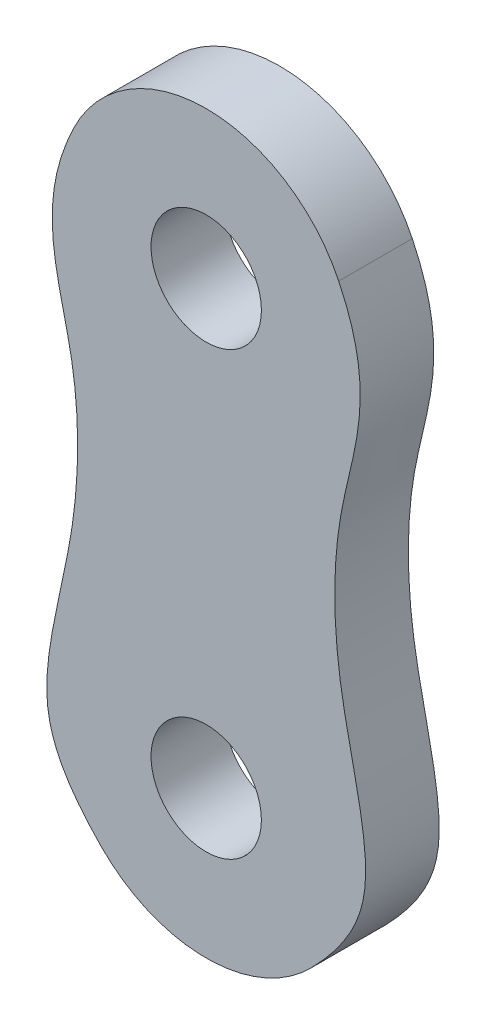
ISO-10303-21;
HEADER;
FILE_DESCRIPTION(('STEP AP214'),'2;1');
FILE_NAME('part.step','',(''),(''),'','','');
FILE_SCHEMA(('AUTOMOTIVE_DESIGN { 1 0 10303 214 1 1 1 1 }'));
ENDSEC;
DATA;
#1=APPLICATION_CONTEXT('core data for automotive mechanical design processes');
#2=APPLICATION_PROTOCOL_DEFINITION('international standard','automotive_design',2000,#1);
#3=PRODUCT_CONTEXT('',#1,'mechanical');
#4=PRODUCT('Part','Part','',(#3));
#5=PRODUCT_RELATED_PRODUCT_CATEGORY('part','',(#4));
#6=PRODUCT_DEFINITION_FORMATION('','',#4);
#7=PRODUCT_DEFINITION_CONTEXT('part definition',#1,'design');
#8=PRODUCT_DEFINITION('design','',#6,#7);
#9=PRODUCT_DEFINITION_SHAPE('','',#8);
#10=(LENGTH_UNIT() NAMED_UNIT(*) SI_UNIT(.MILLI.,.METRE.));
#11=(NAMED_UNIT(*) PLANE_ANGLE_UNIT() SI_UNIT($,.RADIAN.));
#12=(NAMED_UNIT(*) SI_UNIT($,.STERADIAN.) SOLID_ANGLE_UNIT());
#13=UNCERTAINTY_MEASURE_WITH_UNIT(LENGTH_MEASURE(1.E-05),#10,'distance_accuracy_value','');
#14=(GEOMETRIC_REPRESENTATION_CONTEXT(3) GLOBAL_UNCERTAINTY_ASSIGNED_CONTEXT((#13)) GLOBAL_UNIT_ASSIGNED_CONTEXT((#10,
#11,#12)) REPRESENTATION_CONTEXT('',''));
#15=CARTESIAN_POINT('',(0.,0.,0.));
#16=DIRECTION('',(0.,0.,1.));
#17=DIRECTION('',(1.,0.,0.));
#18=AXIS2_PLACEMENT_3D('',#15,#16,#17);
#19=CARTESIAN_POINT('',(5.71857736022503,21.8105023048572,3.175));
#20=CARTESIAN_POINT('',(7.46046495290906,18.2020579525185,3.175));
#21=CARTESIAN_POINT('',(5.43739337266652,14.1114306592331,3.175));
#22=CARTESIAN_POINT('',(5.47473955855085,6.88331535733343,3.175));
#23=CARTESIAN_POINT('',(7.33860220324202,0.649545132555866,3.175));
#24=CARTESIAN_POINT('',(6.6192049621046,-2.30987555380304,3.175));
#25=CARTESIAN_POINT('',(4.54379880332444,-4.4358079799409,3.175));
#26=B_SPLINE_CURVE_WITH_KNOTS('',3,(#19,#20,#21,#22,#23,#24,#25),.UNSPECIFIED.,.F.,.F.,(4,1,1,1,
4),(0.,0.323130598608619,0.562945369078712,0.783927572137345,1.),.UNSPECIFIED.);
#27=DIRECTION('',(0.,0.,-1.));
#28=VECTOR('',#27,1.);
#29=SURFACE_OF_LINEAR_EXTRUSION('',#26,#28);
#30=CARTESIAN_POINT('',(5.71857736022503,21.8105023048572,0.));
#31=CARTESIAN_POINT('',(7.46046495290906,18.2020579525185,0.));
#32=CARTESIAN_POINT('',(5.43739337266652,14.1114306592331,0.));
#33=CARTESIAN_POINT('',(5.47473955855085,6.88331535733343,0.));
#34=CARTESIAN_POINT('',(7.33860220324202,0.649545132555866,0.));
#35=CARTESIAN_POINT('',(6.6192049621046,-2.30987555380304,0.));
#36=CARTESIAN_POINT('',(4.54379880332444,-4.4358079799409,0.));
#37=B_SPLINE_CURVE_WITH_KNOTS('',3,(#30,#31,#32,#33,#34,#35,#36),.UNSPECIFIED.,.F.,.F.,(4,1,1,1,
4),(0.,0.323130598608619,0.562945369078712,0.783927572137345,1.),.UNSPECIFIED.);
#38=CARTESIAN_POINT('',(5.71857736022502,21.8105023048572,0.));
#39=VERTEX_POINT('',#38);
#40=CARTESIAN_POINT('',(4.54379880332444,-4.4358079799409,0.));
#41=VERTEX_POINT('',#40);
#42=EDGE_CURVE('E116',#39,#41,#37,.T.);
#43=ORIENTED_EDGE('',*,*,#42,.F.);
#44=DIRECTION('',(0.,0.,-1.));
#45=VECTOR('',#44,1.);
#46=CARTESIAN_POINT('',(5.71857736022502,21.8105023048572,3.175));
#47=LINE('',#46,#45);
#48=CARTESIAN_POINT('',(5.71857736022502,21.8105023048572,3.175));
#49=VERTEX_POINT('',#48);
#50=EDGE_CURVE('E11',#49,#39,#47,.T.);
#51=ORIENTED_EDGE('',*,*,#50,.F.);
#52=CARTESIAN_POINT('',(4.54379880332444,-4.4358079799409,3.175));
#53=VERTEX_POINT('',#52);
#54=EDGE_CURVE('E85',#49,#53,#26,.T.);
#55=ORIENTED_EDGE('',*,*,#54,.T.);
#56=DIRECTION('',(0.,0.,-1.));
#57=VECTOR('',#56,1.);
#58=CARTESIAN_POINT('',(4.54379880332444,-4.4358079799409,3.175));
#59=LINE('',#58,#57);
#60=EDGE_CURVE('E73',#53,#41,#59,.T.);
#61=ORIENTED_EDGE('',*,*,#60,.T.);
#62=EDGE_LOOP('',(#43,#51,#55,#61));
#63=FACE_BOUND('',#62,.T.);
#64=ADVANCED_FACE('F33',(#63),#29,.T.);
#65=CARTESIAN_POINT('',(0.,19.05,3.175));
#66=DIRECTION('',(0.,0.,-1.));
#67=DIRECTION('',(-1.,0.,0.));
#68=AXIS2_PLACEMENT_3D('',#65,#66,#67);
#69=CYLINDRICAL_SURFACE('',#68,6.35);
#70=CARTESIAN_POINT('',(0.,19.05,0.));
#71=DIRECTION('',(0.,0.,1.));
#72=DIRECTION('',(1.,0.,0.));
#73=AXIS2_PLACEMENT_3D('',#70,#71,#72);
#74=CIRCLE('',#73,6.35);
#75=CARTESIAN_POINT('',(-5.71857736022502,21.8105023048572,0.));
#76=VERTEX_POINT('',#75);
#77=EDGE_CURVE('E90',#39,#76,#74,.T.);
#78=ORIENTED_EDGE('',*,*,#77,.T.);
#79=DIRECTION('',(0.,0.,-1.));
#80=VECTOR('',#79,1.);
#81=CARTESIAN_POINT('',(-5.71857736022502,21.8105023048572,3.175));
#82=LINE('',#81,#80);
#83=CARTESIAN_POINT('',(-5.71857736022502,21.8105023048572,3.175));
#84=VERTEX_POINT('',#83);
#85=EDGE_CURVE('E42',#84,#76,#82,.T.);
#86=ORIENTED_EDGE('',*,*,#85,.F.);
#87=CARTESIAN_POINT('',(0.,19.05,3.175));
#88=DIRECTION('',(0.,0.,1.));
#89=DIRECTION('',(1.,0.,0.));
#90=AXIS2_PLACEMENT_3D('',#87,#88,#89);
#91=CIRCLE('',#90,6.35);
#92=EDGE_CURVE('E79',#49,#84,#91,.T.);
#93=ORIENTED_EDGE('',*,*,#92,.F.);
#94=ORIENTED_EDGE('',*,*,#50,.T.);
#95=EDGE_LOOP('',(#78,#86,#93,#94));
#96=FACE_BOUND('',#95,.T.);
#97=ADVANCED_FACE('F88',(#96),#69,.T.);
#98=CARTESIAN_POINT('',(-5.71857736022503,21.8105023048572,3.175));
#99=CARTESIAN_POINT('',(-7.46046495290906,18.2020579525185,3.175));
#100=CARTESIAN_POINT('',(-5.43739337266652,14.1114306592331,3.175));
#101=CARTESIAN_POINT('',(-5.47473955855085,6.88331535733342,3.175));
#102=CARTESIAN_POINT('',(-7.33860220324202,0.649545132555867,3.175));
#103=CARTESIAN_POINT('',(-6.6192049621046,-2.30987555380304,3.175));
#104=CARTESIAN_POINT('',(-4.54379880332444,-4.4358079799409,3.175));
#105=B_SPLINE_CURVE_WITH_KNOTS('',3,(#98,#99,#100,#101,#102,#103,#104),.UNSPECIFIED.,.F.,.F.,(4,
1,1,1,4),(0.,0.323130598608619,0.562945369078712,0.783927572137345,1.),.UNSPECIFIED.);
#106=DIRECTION('',(0.,0.,-1.));
#107=VECTOR('',#106,1.);
#108=SURFACE_OF_LINEAR_EXTRUSION('',#105,#107);
#109=CARTESIAN_POINT('',(-5.71857736022503,21.8105023048572,0.));
#110=CARTESIAN_POINT('',(-7.46046495290906,18.2020579525185,0.));
#111=CARTESIAN_POINT('',(-5.43739337266652,14.1114306592331,0.));
#112=CARTESIAN_POINT('',(-5.47473955855085,6.88331535733342,0.));
#113=CARTESIAN_POINT('',(-7.33860220324202,0.649545132555867,0.));
#114=CARTESIAN_POINT('',(-6.6192049621046,-2.30987555380304,0.));
#115=CARTESIAN_POINT('',(-4.54379880332444,-4.4358079799409,0.));
#116=B_SPLINE_CURVE_WITH_KNOTS('',3,(#109,#110,#111,#112,#113,#114,#115),.UNSPECIFIED.,.F.,.F.,
(4,1,1,1,4),(0.,0.323130598608619,0.562945369078712,0.783927572137345,1.),.UNSPECIFIED.);
#117=CARTESIAN_POINT('',(-4.54379880332444,-4.4358079799409,0.));
#118=VERTEX_POINT('',#117);
#119=EDGE_CURVE('E66',#76,#118,#116,.T.);
#120=ORIENTED_EDGE('',*,*,#119,.T.);
#121=DIRECTION('',(0.,0.,-1.));
#122=VECTOR('',#121,1.);
#123=CARTESIAN_POINT('',(-4.54379880332444,-4.4358079799409,3.175));
#124=LINE('',#123,#122);
#125=CARTESIAN_POINT('',(-4.54379880332444,-4.4358079799409,3.175));
#126=VERTEX_POINT('',#125);
#127=EDGE_CURVE('E91',#126,#118,#124,.T.);
#128=ORIENTED_EDGE('',*,*,#127,.F.);
#129=EDGE_CURVE('E84',#84,#126,#105,.T.);
#130=ORIENTED_EDGE('',*,*,#129,.F.);
#131=ORIENTED_EDGE('',*,*,#85,.T.);
#132=EDGE_LOOP('',(#120,#128,#130,#131));
#133=FACE_BOUND('',#132,.T.);
#134=ADVANCED_FACE('F92',(#133),#108,.F.);
#135=CARTESIAN_POINT('',(0.,19.05,3.175));
#136=DIRECTION('',(0.,0.,-1.));
#137=DIRECTION('',(-1.,0.,0.));
#138=AXIS2_PLACEMENT_3D('',#135,#136,#137);
#139=CYLINDRICAL_SURFACE('',#138,2.38125);
#140=CARTESIAN_POINT('',(0.,19.05,3.175));
#141=DIRECTION('',(0.,0.,1.));
#142=DIRECTION('',(1.,0.,0.));
#143=AXIS2_PLACEMENT_3D('',#140,#141,#142);
#144=CIRCLE('',#143,2.38125);
#145=CARTESIAN_POINT('',(2.38125,19.05,3.175));
#146=VERTEX_POINT('',#145);
#147=EDGE_CURVE('E94',#146,#146,#144,.T.);
#148=ORIENTED_EDGE('',*,*,#147,.T.);
#149=EDGE_LOOP('',(#148));
#150=FACE_BOUND('',#149,.T.);
#151=CARTESIAN_POINT('',(0.,19.05,0.));
#152=DIRECTION('',(0.,0.,1.));
#153=DIRECTION('',(1.,0.,0.));
#154=AXIS2_PLACEMENT_3D('',#151,#152,#153);
#155=CIRCLE('',#154,2.38125);
#156=CARTESIAN_POINT('',(2.38125,19.05,0.));
#157=VERTEX_POINT('',#156);
#158=EDGE_CURVE('E137',#157,#157,#155,.T.);
#159=ORIENTED_EDGE('',*,*,#158,.F.);
#160=EDGE_LOOP('',(#159));
#161=FACE_BOUND('',#160,.T.);
#162=ADVANCED_FACE('F106',(#150,#161),#139,.F.);
#163=CARTESIAN_POINT('',(0.,0.,3.175));
#164=DIRECTION('',(0.,0.,-1.));
#165=DIRECTION('',(-1.,0.,0.));
#166=AXIS2_PLACEMENT_3D('',#163,#164,#165);
#167=CYLINDRICAL_SURFACE('',#166,6.35);
#168=CARTESIAN_POINT('',(0.,0.,0.));
#169=DIRECTION('',(0.,0.,1.));
#170=DIRECTION('',(1.,0.,0.));
#171=AXIS2_PLACEMENT_3D('',#168,#169,#170);
#172=CIRCLE('',#171,6.35);
#173=EDGE_CURVE('E132',#118,#41,#172,.T.);
#174=ORIENTED_EDGE('',*,*,#173,.T.);
#175=ORIENTED_EDGE('',*,*,#60,.F.);
#176=CARTESIAN_POINT('',(0.,0.,3.175));
#177=DIRECTION('',(0.,0.,1.));
#178=DIRECTION('',(1.,0.,0.));
#179=AXIS2_PLACEMENT_3D('',#176,#177,#178);
#180=CIRCLE('',#179,6.35);
#181=EDGE_CURVE('E50',#126,#53,#180,.T.);
#182=ORIENTED_EDGE('',*,*,#181,.F.);
#183=ORIENTED_EDGE('',*,*,#127,.T.);
#184=EDGE_LOOP('',(#174,#175,#182,#183));
#185=FACE_BOUND('',#184,.T.);
#186=ADVANCED_FACE('F107',(#185),#167,.T.);
#187=CARTESIAN_POINT('',(0.,0.,3.175));
#188=DIRECTION('',(0.,0.,-1.));
#189=DIRECTION('',(-1.,0.,0.));
#190=AXIS2_PLACEMENT_3D('',#187,#188,#189);
#191=CYLINDRICAL_SURFACE('',#190,2.38125);
#192=CARTESIAN_POINT('',(0.,0.,3.175));
#193=DIRECTION('',(0.,0.,1.));
#194=DIRECTION('',(1.,0.,0.));
#195=AXIS2_PLACEMENT_3D('',#192,#193,#194);
#196=CIRCLE('',#195,2.38125);
#197=CARTESIAN_POINT('',(2.38125,0.,3.175));
#198=VERTEX_POINT('',#197);
#199=EDGE_CURVE('E124',#198,#198,#196,.T.);
#200=ORIENTED_EDGE('',*,*,#199,.T.);
#201=EDGE_LOOP('',(#200));
#202=FACE_BOUND('',#201,.T.);
#203=CARTESIAN_POINT('',(0.,0.,0.));
#204=DIRECTION('',(0.,0.,1.));
#205=DIRECTION('',(1.,0.,0.));
#206=AXIS2_PLACEMENT_3D('',#203,#204,#205);
#207=CIRCLE('',#206,2.38125);
#208=CARTESIAN_POINT('',(2.38125,0.,0.));
#209=VERTEX_POINT('',#208);
#210=EDGE_CURVE('E140',#209,#209,#207,.T.);
#211=ORIENTED_EDGE('',*,*,#210,.F.);
#212=EDGE_LOOP('',(#211));
#213=FACE_BOUND('',#212,.T.);
#214=ADVANCED_FACE('F153',(#202,#213),#191,.F.);
#215=CARTESIAN_POINT('',(0.,0.,3.175));
#216=DIRECTION('',(0.,0.,1.));
#217=DIRECTION('',(1.,0.,0.));
#218=AXIS2_PLACEMENT_3D('',#215,#216,#217);
#219=PLANE('',#218);
#220=ORIENTED_EDGE('',*,*,#54,.F.);
#221=ORIENTED_EDGE('',*,*,#92,.T.);
#222=ORIENTED_EDGE('',*,*,#129,.T.);
#223=ORIENTED_EDGE('',*,*,#181,.T.);
#224=EDGE_LOOP('',(#220,#221,#222,#223));
#225=FACE_BOUND('',#224,.T.);
#226=ORIENTED_EDGE('',*,*,#147,.F.);
#227=EDGE_LOOP('',(#226));
#228=FACE_BOUND('',#227,.T.);
#229=ORIENTED_EDGE('',*,*,#199,.F.);
#230=EDGE_LOOP('',(#229));
#231=FACE_BOUND('',#230,.T.);
#232=ADVANCED_FACE('F81',(#225,#228,#231),#219,.T.);
#233=CARTESIAN_POINT('',(0.,0.,0.));
#234=DIRECTION('',(0.,0.,1.));
#235=DIRECTION('',(1.,0.,0.));
#236=AXIS2_PLACEMENT_3D('',#233,#234,#235);
#237=PLANE('',#236);
#238=ORIENTED_EDGE('',*,*,#42,.T.);
#239=ORIENTED_EDGE('',*,*,#173,.F.);
#240=ORIENTED_EDGE('',*,*,#119,.F.);
#241=ORIENTED_EDGE('',*,*,#77,.F.);
#242=EDGE_LOOP('',(#238,#239,#240,#241));
#243=FACE_BOUND('',#242,.T.);
#244=ORIENTED_EDGE('',*,*,#158,.T.);
#245=EDGE_LOOP('',(#244));
#246=FACE_BOUND('',#245,.T.);
#247=ORIENTED_EDGE('',*,*,#210,.T.);
#248=EDGE_LOOP('',(#247));
#249=FACE_BOUND('',#248,.T.);
#250=ADVANCED_FACE('F145',(#243,#246,#249),#237,.F.);
#251=CLOSED_SHELL('',(#64,#97,#134,#162,#186,#214,#232,#250));
#252=MANIFOLD_SOLID_BREP('B2',#251);
#253=ADVANCED_BREP_SHAPE_REPRESENTATION('',(#18,#252),#14);
#254=SHAPE_DEFINITION_REPRESENTATION(#9,#253);
ENDSEC;
END-ISO-10303-21;
